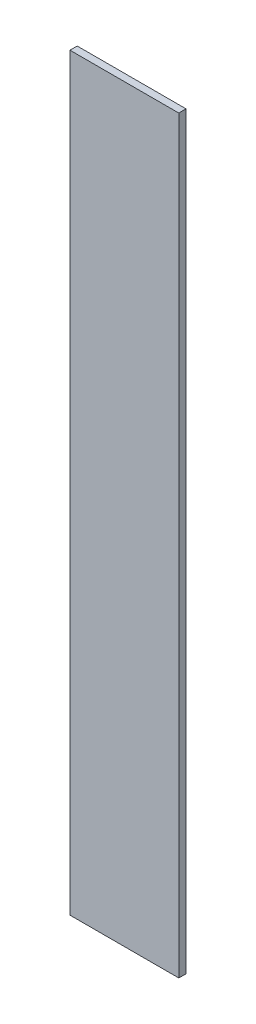
ISO-10303-21;
HEADER;
FILE_DESCRIPTION(('STEP AP214'),'2;1');
FILE_NAME('part.step','',(''),(''),'','','');
FILE_SCHEMA(('AUTOMOTIVE_DESIGN { 1 0 10303 214 1 1 1 1 }'));
ENDSEC;
DATA;
#1=APPLICATION_CONTEXT('core data for automotive mechanical design processes');
#2=APPLICATION_PROTOCOL_DEFINITION('international standard','automotive_design',2000,#1);
#3=PRODUCT_CONTEXT('',#1,'mechanical');
#4=PRODUCT('Part','Part','',(#3));
#5=PRODUCT_RELATED_PRODUCT_CATEGORY('part','',(#4));
#6=PRODUCT_DEFINITION_FORMATION('','',#4);
#7=PRODUCT_DEFINITION_CONTEXT('part definition',#1,'design');
#8=PRODUCT_DEFINITION('design','',#6,#7);
#9=PRODUCT_DEFINITION_SHAPE('','',#8);
#10=(LENGTH_UNIT() NAMED_UNIT(*) SI_UNIT(.MILLI.,.METRE.));
#11=(NAMED_UNIT(*) PLANE_ANGLE_UNIT() SI_UNIT($,.RADIAN.));
#12=(NAMED_UNIT(*) SI_UNIT($,.STERADIAN.) SOLID_ANGLE_UNIT());
#13=UNCERTAINTY_MEASURE_WITH_UNIT(LENGTH_MEASURE(1.E-05),#10,'distance_accuracy_value','');
#14=(GEOMETRIC_REPRESENTATION_CONTEXT(3) GLOBAL_UNCERTAINTY_ASSIGNED_CONTEXT((#13)) GLOBAL_UNIT_ASSIGNED_CONTEXT((#10,
#11,#12)) REPRESENTATION_CONTEXT('',''));
#15=CARTESIAN_POINT('',(0.,0.,0.));
#16=DIRECTION('',(0.,0.,1.));
#17=DIRECTION('',(1.,0.,0.));
#18=AXIS2_PLACEMENT_3D('',#15,#16,#17);
#19=CARTESIAN_POINT('',(0.,0.,0.2));
#20=DIRECTION('',(1.,0.,0.));
#21=DIRECTION('',(0.,0.,-1.));
#22=AXIS2_PLACEMENT_3D('',#19,#20,#21);
#23=PLANE('',#22);
#24=DIRECTION('',(0.,-1.,0.));
#25=VECTOR('',#24,1.);
#26=CARTESIAN_POINT('',(0.,0.,0.));
#27=LINE('',#26,#25);
#28=CARTESIAN_POINT('',(0.,20.65,0.));
#29=VERTEX_POINT('',#28);
#30=CARTESIAN_POINT('',(0.,0.,0.));
#31=VERTEX_POINT('',#30);
#32=EDGE_CURVE('E96',#29,#31,#27,.T.);
#33=ORIENTED_EDGE('',*,*,#32,.T.);
#34=DIRECTION('',(0.,0.,-1.));
#35=VECTOR('',#34,1.);
#36=CARTESIAN_POINT('',(0.,0.,0.2));
#37=LINE('',#36,#35);
#38=CARTESIAN_POINT('',(0.,0.,0.2));
#39=VERTEX_POINT('',#38);
#40=EDGE_CURVE('E11',#39,#31,#37,.T.);
#41=ORIENTED_EDGE('',*,*,#40,.F.);
#42=DIRECTION('',(0.,-1.,0.));
#43=VECTOR('',#42,1.);
#44=CARTESIAN_POINT('',(0.,0.,0.2));
#45=LINE('',#44,#43);
#46=CARTESIAN_POINT('',(0.,20.65,0.2));
#47=VERTEX_POINT('',#46);
#48=EDGE_CURVE('E84',#47,#39,#45,.T.);
#49=ORIENTED_EDGE('',*,*,#48,.F.);
#50=DIRECTION('',(0.,0.,-1.));
#51=VECTOR('',#50,1.);
#52=CARTESIAN_POINT('',(0.,20.65,0.2));
#53=LINE('',#52,#51);
#54=EDGE_CURVE('E92',#47,#29,#53,.T.);
#55=ORIENTED_EDGE('',*,*,#54,.T.);
#56=EDGE_LOOP('',(#33,#41,#49,#55));
#57=FACE_BOUND('',#56,.T.);
#58=ADVANCED_FACE('F33',(#57),#23,.F.);
#59=CARTESIAN_POINT('',(0.,0.,0.2));
#60=DIRECTION('',(0.,1.,0.));
#61=DIRECTION('',(0.,0.,1.));
#62=AXIS2_PLACEMENT_3D('',#59,#60,#61);
#63=PLANE('',#62);
#64=DIRECTION('',(1.,0.,0.));
#65=VECTOR('',#64,1.);
#66=CARTESIAN_POINT('',(0.,0.,0.));
#67=LINE('',#66,#65);
#68=CARTESIAN_POINT('',(3.,0.,0.));
#69=VERTEX_POINT('',#68);
#70=EDGE_CURVE('E88',#31,#69,#67,.T.);
#71=ORIENTED_EDGE('',*,*,#70,.T.);
#72=DIRECTION('',(0.,0.,-1.));
#73=VECTOR('',#72,1.);
#74=CARTESIAN_POINT('',(3.,0.,0.2));
#75=LINE('',#74,#73);
#76=CARTESIAN_POINT('',(3.,0.,0.2));
#77=VERTEX_POINT('',#76);
#78=EDGE_CURVE('E41',#77,#69,#75,.T.);
#79=ORIENTED_EDGE('',*,*,#78,.F.);
#80=DIRECTION('',(1.,0.,0.));
#81=VECTOR('',#80,1.);
#82=CARTESIAN_POINT('',(0.,0.,0.2));
#83=LINE('',#82,#81);
#84=EDGE_CURVE('E79',#39,#77,#83,.T.);
#85=ORIENTED_EDGE('',*,*,#84,.F.);
#86=ORIENTED_EDGE('',*,*,#40,.T.);
#87=EDGE_LOOP('',(#71,#79,#85,#86));
#88=FACE_BOUND('',#87,.T.);
#89=ADVANCED_FACE('F87',(#88),#63,.F.);
#90=CARTESIAN_POINT('',(3.,0.,0.2));
#91=DIRECTION('',(-1.,0.,0.));
#92=DIRECTION('',(0.,0.,1.));
#93=AXIS2_PLACEMENT_3D('',#90,#91,#92);
#94=PLANE('',#93);
#95=DIRECTION('',(0.,1.,0.));
#96=VECTOR('',#95,1.);
#97=CARTESIAN_POINT('',(3.,0.,0.));
#98=LINE('',#97,#96);
#99=CARTESIAN_POINT('',(3.,20.65,0.));
#100=VERTEX_POINT('',#99);
#101=EDGE_CURVE('E66',#69,#100,#98,.T.);
#102=ORIENTED_EDGE('',*,*,#101,.T.);
#103=DIRECTION('',(0.,0.,-1.));
#104=VECTOR('',#103,1.);
#105=CARTESIAN_POINT('',(3.,20.65,0.2));
#106=LINE('',#105,#104);
#107=CARTESIAN_POINT('',(3.,20.65,0.2));
#108=VERTEX_POINT('',#107);
#109=EDGE_CURVE('E89',#108,#100,#106,.T.);
#110=ORIENTED_EDGE('',*,*,#109,.F.);
#111=DIRECTION('',(0.,1.,0.));
#112=VECTOR('',#111,1.);
#113=CARTESIAN_POINT('',(3.,0.,0.2));
#114=LINE('',#113,#112);
#115=EDGE_CURVE('E82',#77,#108,#114,.T.);
#116=ORIENTED_EDGE('',*,*,#115,.F.);
#117=ORIENTED_EDGE('',*,*,#78,.T.);
#118=EDGE_LOOP('',(#102,#110,#116,#117));
#119=FACE_BOUND('',#118,.T.);
#120=ADVANCED_FACE('F90',(#119),#94,.F.);
#121=CARTESIAN_POINT('',(0.,20.65,0.2));
#122=DIRECTION('',(0.,-1.,0.));
#123=DIRECTION('',(0.,0.,-1.));
#124=AXIS2_PLACEMENT_3D('',#121,#122,#123);
#125=PLANE('',#124);
#126=DIRECTION('',(-1.,0.,0.));
#127=VECTOR('',#126,1.);
#128=CARTESIAN_POINT('',(0.,20.65,0.));
#129=LINE('',#128,#127);
#130=EDGE_CURVE('E72',#100,#29,#129,.T.);
#131=ORIENTED_EDGE('',*,*,#130,.T.);
#132=ORIENTED_EDGE('',*,*,#54,.F.);
#133=DIRECTION('',(-1.,0.,0.));
#134=VECTOR('',#133,1.);
#135=CARTESIAN_POINT('',(0.,20.65,0.2));
#136=LINE('',#135,#134);
#137=EDGE_CURVE('E49',#108,#47,#136,.T.);
#138=ORIENTED_EDGE('',*,*,#137,.F.);
#139=ORIENTED_EDGE('',*,*,#109,.T.);
#140=EDGE_LOOP('',(#131,#132,#138,#139));
#141=FACE_BOUND('',#140,.T.);
#142=ADVANCED_FACE('F103',(#141),#125,.F.);
#143=CARTESIAN_POINT('',(0.,0.,0.2));
#144=DIRECTION('',(0.,0.,-1.));
#145=DIRECTION('',(-1.,0.,0.));
#146=AXIS2_PLACEMENT_3D('',#143,#144,#145);
#147=PLANE('',#146);
#148=ORIENTED_EDGE('',*,*,#48,.T.);
#149=ORIENTED_EDGE('',*,*,#84,.T.);
#150=ORIENTED_EDGE('',*,*,#115,.T.);
#151=ORIENTED_EDGE('',*,*,#137,.T.);
#152=EDGE_LOOP('',(#148,#149,#150,#151));
#153=FACE_BOUND('',#152,.T.);
#154=ADVANCED_FACE('F80',(#153),#147,.F.);
#155=CARTESIAN_POINT('',(0.,0.,0.));
#156=DIRECTION('',(0.,0.,-1.));
#157=DIRECTION('',(-1.,0.,0.));
#158=AXIS2_PLACEMENT_3D('',#155,#156,#157);
#159=PLANE('',#158);
#160=ORIENTED_EDGE('',*,*,#32,.F.);
#161=ORIENTED_EDGE('',*,*,#130,.F.);
#162=ORIENTED_EDGE('',*,*,#101,.F.);
#163=ORIENTED_EDGE('',*,*,#70,.F.);
#164=EDGE_LOOP('',(#160,#161,#162,#163));
#165=FACE_BOUND('',#164,.T.);
#166=ADVANCED_FACE('F106',(#165),#159,.T.);
#167=CLOSED_SHELL('',(#58,#89,#120,#142,#154,#166));
#168=MANIFOLD_SOLID_BREP('B2',#167);
#169=ADVANCED_BREP_SHAPE_REPRESENTATION('',(#18,#168),#14);
#170=SHAPE_DEFINITION_REPRESENTATION(#9,#169);
ENDSEC;
END-ISO-10303-21;
